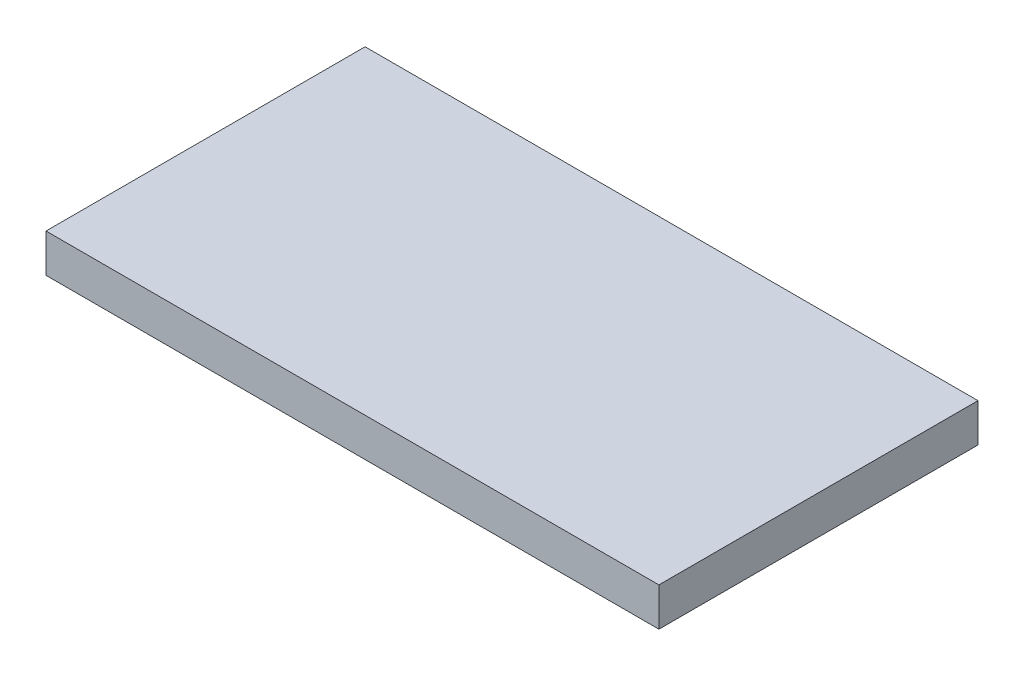
ISO-10303-21;
HEADER;
FILE_DESCRIPTION(('STEP AP214'),'2;1');
FILE_NAME('part.step','',(''),(''),'','','');
FILE_SCHEMA(('AUTOMOTIVE_DESIGN { 1 0 10303 214 1 1 1 1 }'));
ENDSEC;
DATA;
#1=APPLICATION_CONTEXT('core data for automotive mechanical design processes');
#2=APPLICATION_PROTOCOL_DEFINITION('international standard','automotive_design',2000,#1);
#3=PRODUCT_CONTEXT('',#1,'mechanical');
#4=PRODUCT('Part','Part','',(#3));
#5=PRODUCT_RELATED_PRODUCT_CATEGORY('part','',(#4));
#6=PRODUCT_DEFINITION_FORMATION('','',#4);
#7=PRODUCT_DEFINITION_CONTEXT('part definition',#1,'design');
#8=PRODUCT_DEFINITION('design','',#6,#7);
#9=PRODUCT_DEFINITION_SHAPE('','',#8);
#10=(LENGTH_UNIT() NAMED_UNIT(*) SI_UNIT(.MILLI.,.METRE.));
#11=(NAMED_UNIT(*) PLANE_ANGLE_UNIT() SI_UNIT($,.RADIAN.));
#12=(NAMED_UNIT(*) SI_UNIT($,.STERADIAN.) SOLID_ANGLE_UNIT());
#13=UNCERTAINTY_MEASURE_WITH_UNIT(LENGTH_MEASURE(1.E-05),#10,'distance_accuracy_value','');
#14=(GEOMETRIC_REPRESENTATION_CONTEXT(3) GLOBAL_UNCERTAINTY_ASSIGNED_CONTEXT((#13)) GLOBAL_UNIT_ASSIGNED_CONTEXT((#10,
#11,#12)) REPRESENTATION_CONTEXT('',''));
#15=CARTESIAN_POINT('',(0.,0.,0.));
#16=DIRECTION('',(0.,0.,1.));
#17=DIRECTION('',(1.,0.,0.));
#18=AXIS2_PLACEMENT_3D('',#15,#16,#17);
#19=CARTESIAN_POINT('',(-60.2033127592154,19.05,21.010039351249));
#20=DIRECTION('',(1.,0.,0.));
#21=DIRECTION('',(0.,0.,-1.));
#22=AXIS2_PLACEMENT_3D('',#19,#20,#21);
#23=PLANE('',#22);
#24=DIRECTION('',(0.,0.,1.));
#25=VECTOR('',#24,1.);
#26=CARTESIAN_POINT('',(-60.2033127592154,0.,21.010039351249));
#27=LINE('',#26,#25);
#28=CARTESIAN_POINT('',(-60.2033127592154,0.,-137.257360648754));
#29=VERTEX_POINT('',#28);
#30=CARTESIAN_POINT('',(-60.2033127592154,0.,21.010039351249));
#31=VERTEX_POINT('',#30);
#32=EDGE_CURVE('E115',#29,#31,#27,.T.);
#33=ORIENTED_EDGE('',*,*,#32,.T.);
#34=DIRECTION('',(0.,-1.,0.));
#35=VECTOR('',#34,1.);
#36=CARTESIAN_POINT('',(-60.2033127592154,19.05,21.010039351249));
#37=LINE('',#36,#35);
#38=CARTESIAN_POINT('',(-60.2033127592154,19.05,21.010039351249));
#39=VERTEX_POINT('',#38);
#40=EDGE_CURVE('E12',#39,#31,#37,.T.);
#41=ORIENTED_EDGE('',*,*,#40,.F.);
#42=DIRECTION('',(0.,0.,1.));
#43=VECTOR('',#42,1.);
#44=CARTESIAN_POINT('',(-60.2033127592154,19.05,21.010039351249));
#45=LINE('',#44,#43);
#46=CARTESIAN_POINT('',(-60.2033127592154,19.05,-137.257360648754));
#47=VERTEX_POINT('',#46);
#48=EDGE_CURVE('E99',#47,#39,#45,.T.);
#49=ORIENTED_EDGE('',*,*,#48,.F.);
#50=DIRECTION('',(0.,-1.,0.));
#51=VECTOR('',#50,1.);
#52=CARTESIAN_POINT('',(-60.2033127592154,19.05,-137.257360648754));
#53=LINE('',#52,#51);
#54=EDGE_CURVE('E111',#47,#29,#53,.T.);
#55=ORIENTED_EDGE('',*,*,#54,.T.);
#56=EDGE_LOOP('',(#33,#41,#49,#55));
#57=FACE_BOUND('',#56,.T.);
#58=ADVANCED_FACE('F47',(#57),#23,.F.);
#59=CARTESIAN_POINT('',(-60.2033127592154,19.05,21.010039351249));
#60=DIRECTION('',(0.,0.,-1.));
#61=DIRECTION('',(-1.,0.,0.));
#62=AXIS2_PLACEMENT_3D('',#59,#60,#61);
#63=PLANE('',#62);
#64=DIRECTION('',(1.,0.,0.));
#65=VECTOR('',#64,1.);
#66=CARTESIAN_POINT('',(-60.2033127592154,0.,21.010039351249));
#67=LINE('',#66,#65);
#68=CARTESIAN_POINT('',(243.801587240779,0.,21.010039351249));
#69=VERTEX_POINT('',#68);
#70=EDGE_CURVE('E104',#31,#69,#67,.T.);
#71=ORIENTED_EDGE('',*,*,#70,.T.);
#72=DIRECTION('',(0.,-1.,0.));
#73=VECTOR('',#72,1.);
#74=CARTESIAN_POINT('',(243.801587240779,19.05,21.010039351249));
#75=LINE('',#74,#73);
#76=CARTESIAN_POINT('',(243.801587240779,19.05,21.010039351249));
#77=VERTEX_POINT('',#76);
#78=EDGE_CURVE('E56',#77,#69,#75,.T.);
#79=ORIENTED_EDGE('',*,*,#78,.F.);
#80=DIRECTION('',(1.,0.,0.));
#81=VECTOR('',#80,1.);
#82=CARTESIAN_POINT('',(-60.2033127592154,19.05,21.010039351249));
#83=LINE('',#82,#81);
#84=EDGE_CURVE('E94',#39,#77,#83,.T.);
#85=ORIENTED_EDGE('',*,*,#84,.F.);
#86=ORIENTED_EDGE('',*,*,#40,.T.);
#87=EDGE_LOOP('',(#71,#79,#85,#86));
#88=FACE_BOUND('',#87,.T.);
#89=ADVANCED_FACE('F103',(#88),#63,.F.);
#90=CARTESIAN_POINT('',(243.801587240779,19.05,21.010039351249));
#91=DIRECTION('',(-1.,0.,0.));
#92=DIRECTION('',(0.,0.,1.));
#93=AXIS2_PLACEMENT_3D('',#90,#91,#92);
#94=PLANE('',#93);
#95=DIRECTION('',(0.,0.,-1.));
#96=VECTOR('',#95,1.);
#97=CARTESIAN_POINT('',(243.801587240779,0.,21.010039351249));
#98=LINE('',#97,#96);
#99=CARTESIAN_POINT('',(243.801587240779,0.,-137.257360648754));
#100=VERTEX_POINT('',#99);
#101=EDGE_CURVE('E81',#69,#100,#98,.T.);
#102=ORIENTED_EDGE('',*,*,#101,.T.);
#103=DIRECTION('',(0.,-1.,0.));
#104=VECTOR('',#103,1.);
#105=CARTESIAN_POINT('',(243.801587240779,19.05,-137.257360648754));
#106=LINE('',#105,#104);
#107=CARTESIAN_POINT('',(243.801587240779,19.05,-137.257360648754));
#108=VERTEX_POINT('',#107);
#109=EDGE_CURVE('E106',#108,#100,#106,.T.);
#110=ORIENTED_EDGE('',*,*,#109,.F.);
#111=DIRECTION('',(0.,0.,-1.));
#112=VECTOR('',#111,1.);
#113=CARTESIAN_POINT('',(243.801587240779,19.05,21.010039351249));
#114=LINE('',#113,#112);
#115=EDGE_CURVE('E97',#77,#108,#114,.T.);
#116=ORIENTED_EDGE('',*,*,#115,.F.);
#117=ORIENTED_EDGE('',*,*,#78,.T.);
#118=EDGE_LOOP('',(#102,#110,#116,#117));
#119=FACE_BOUND('',#118,.T.);
#120=ADVANCED_FACE('F107',(#119),#94,.F.);
#121=CARTESIAN_POINT('',(-60.2033127592154,19.05,-137.257360648754));
#122=DIRECTION('',(0.,0.,1.));
#123=DIRECTION('',(1.,0.,0.));
#124=AXIS2_PLACEMENT_3D('',#121,#122,#123);
#125=PLANE('',#124);
#126=DIRECTION('',(-1.,0.,0.));
#127=VECTOR('',#126,1.);
#128=CARTESIAN_POINT('',(-60.2033127592154,0.,-137.257360648754));
#129=LINE('',#128,#127);
#130=EDGE_CURVE('E87',#100,#29,#129,.T.);
#131=ORIENTED_EDGE('',*,*,#130,.T.);
#132=ORIENTED_EDGE('',*,*,#54,.F.);
#133=DIRECTION('',(-1.,0.,0.));
#134=VECTOR('',#133,1.);
#135=CARTESIAN_POINT('',(-60.2033127592154,19.05,-137.257360648754));
#136=LINE('',#135,#134);
#137=EDGE_CURVE('E64',#108,#47,#136,.T.);
#138=ORIENTED_EDGE('',*,*,#137,.F.);
#139=ORIENTED_EDGE('',*,*,#109,.T.);
#140=EDGE_LOOP('',(#131,#132,#138,#139));
#141=FACE_BOUND('',#140,.T.);
#142=ADVANCED_FACE('F128',(#141),#125,.F.);
#143=CARTESIAN_POINT('',(0.,19.05,0.));
#144=DIRECTION('',(0.,-1.,0.));
#145=DIRECTION('',(0.,0.,-1.));
#146=AXIS2_PLACEMENT_3D('',#143,#144,#145);
#147=PLANE('',#146);
#148=ORIENTED_EDGE('',*,*,#48,.T.);
#149=ORIENTED_EDGE('',*,*,#84,.T.);
#150=ORIENTED_EDGE('',*,*,#115,.T.);
#151=ORIENTED_EDGE('',*,*,#137,.T.);
#152=EDGE_LOOP('',(#148,#149,#150,#151));
#153=FACE_BOUND('',#152,.T.);
#154=ADVANCED_FACE('F95',(#153),#147,.F.);
#155=CARTESIAN_POINT('',(0.,0.,0.));
#156=DIRECTION('',(0.,-1.,0.));
#157=DIRECTION('',(0.,0.,-1.));
#158=AXIS2_PLACEMENT_3D('',#155,#156,#157);
#159=PLANE('',#158);
#160=ORIENTED_EDGE('',*,*,#32,.F.);
#161=ORIENTED_EDGE('',*,*,#130,.F.);
#162=ORIENTED_EDGE('',*,*,#101,.F.);
#163=ORIENTED_EDGE('',*,*,#70,.F.);
#164=EDGE_LOOP('',(#160,#161,#162,#163));
#165=FACE_BOUND('',#164,.T.);
#166=ADVANCED_FACE('F131',(#165),#159,.T.);
#167=CLOSED_SHELL('',(#58,#89,#120,#142,#154,#166));
#168=MANIFOLD_SOLID_BREP('B2',#167);
#169=ADVANCED_BREP_SHAPE_REPRESENTATION('',(#18,#168),#14);
#170=SHAPE_DEFINITION_REPRESENTATION(#9,#169);
ENDSEC;
END-ISO-10303-21;
